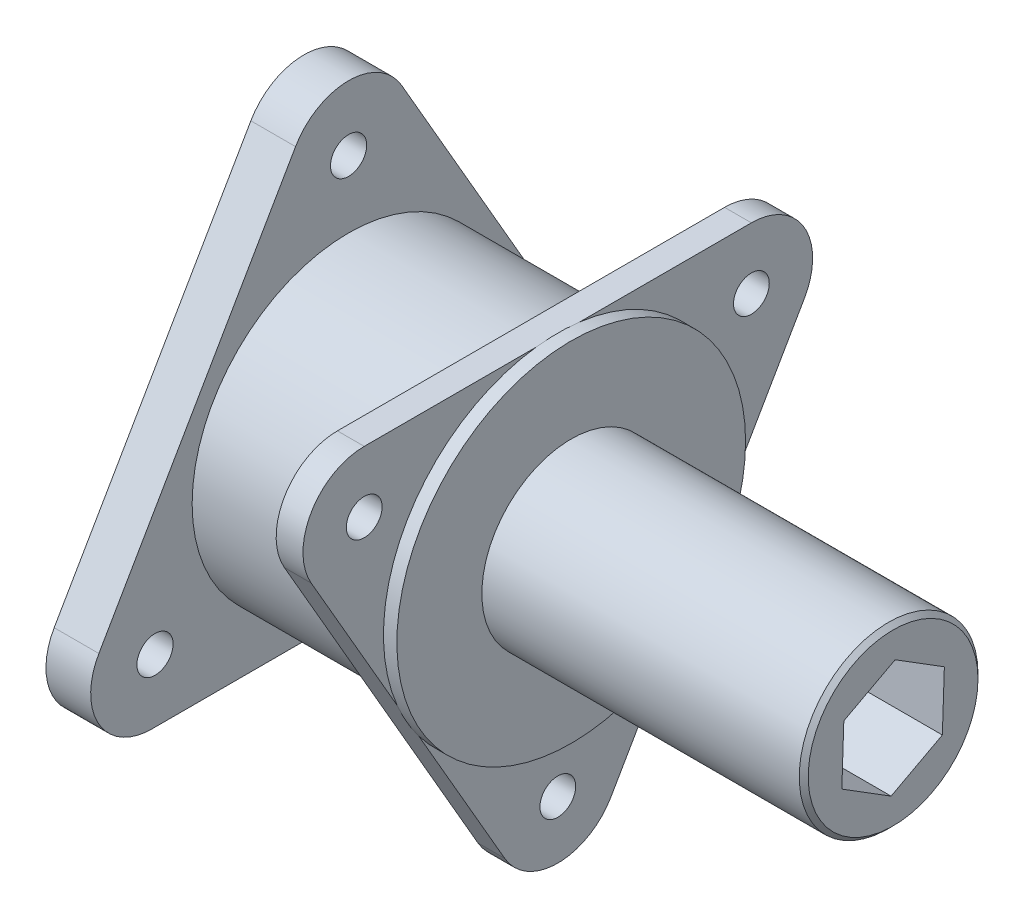
ISO-10303-21;
HEADER;
FILE_DESCRIPTION(('STEP AP214'),'2;1');
FILE_NAME('part.step','',(''),(''),'','','');
FILE_SCHEMA(('AUTOMOTIVE_DESIGN { 1 0 10303 214 1 1 1 1 }'));
ENDSEC;
DATA;
#1=APPLICATION_CONTEXT('core data for automotive mechanical design processes');
#2=APPLICATION_PROTOCOL_DEFINITION('international standard','automotive_design',2000,#1);
#3=PRODUCT_CONTEXT('',#1,'mechanical');
#4=PRODUCT('Part','Part','',(#3));
#5=PRODUCT_RELATED_PRODUCT_CATEGORY('part','',(#4));
#6=PRODUCT_DEFINITION_FORMATION('','',#4);
#7=PRODUCT_DEFINITION_CONTEXT('part definition',#1,'design');
#8=PRODUCT_DEFINITION('design','',#6,#7);
#9=PRODUCT_DEFINITION_SHAPE('','',#8);
#10=(LENGTH_UNIT() NAMED_UNIT(*) SI_UNIT(.MILLI.,.METRE.));
#11=(NAMED_UNIT(*) PLANE_ANGLE_UNIT() SI_UNIT($,.RADIAN.));
#12=(NAMED_UNIT(*) SI_UNIT($,.STERADIAN.) SOLID_ANGLE_UNIT());
#13=UNCERTAINTY_MEASURE_WITH_UNIT(LENGTH_MEASURE(1.E-05),#10,'distance_accuracy_value','');
#14=(GEOMETRIC_REPRESENTATION_CONTEXT(3) GLOBAL_UNCERTAINTY_ASSIGNED_CONTEXT((#13)) GLOBAL_UNIT_ASSIGNED_CONTEXT((#10,
#11,#12)) REPRESENTATION_CONTEXT('',''));
#15=CARTESIAN_POINT('',(0.,0.,0.));
#16=DIRECTION('',(0.,0.,1.));
#17=DIRECTION('',(1.,0.,0.));
#18=AXIS2_PLACEMENT_3D('',#15,#16,#17);
#19=CARTESIAN_POINT('',(56.8,25.,43.3012701892219));
#20=DIRECTION('',(1.,0.,0.));
#21=DIRECTION('',(0.,0.,-1.));
#22=AXIS2_PLACEMENT_3D('',#19,#20,#21);
#23=PLANE('',#22);
#24=CARTESIAN_POINT('',(56.8,-50.8,-4.31280489997456E-12));
#25=DIRECTION('',(1.,0.,0.));
#26=DIRECTION('',(0.,0.,-1.));
#27=AXIS2_PLACEMENT_3D('',#24,#25,#26);
#28=CIRCLE('',#27,4.00000000000446);
#29=CARTESIAN_POINT('',(56.8,-50.8,-4.00000000000878));
#30=VERTEX_POINT('',#29);
#31=EDGE_CURVE('E274',#30,#30,#28,.T.);
#32=ORIENTED_EDGE('',*,*,#31,.F.);
#33=EDGE_LOOP('',(#32));
#34=FACE_BOUND('',#33,.T.);
#35=DIRECTION('',(0.,0.866025403784439,-0.5));
#36=VECTOR('',#35,1.);
#37=CARTESIAN_POINT('',(56.8,18.15,-55.1658182210688));
#38=LINE('',#37,#36);
#39=CARTESIAN_POINT('',(56.8,-56.85,-11.8645480318468));
#40=VERTEX_POINT('',#39);
#41=CARTESIAN_POINT('',(56.8,-23.5312079594299,-31.1011615855431));
#42=VERTEX_POINT('',#41);
#43=EDGE_CURVE('E304',#40,#42,#38,.T.);
#44=ORIENTED_EDGE('',*,*,#43,.T.);
#45=CARTESIAN_POINT('',(56.8,0.,0.));
#46=DIRECTION('',(1.,0.,0.));
#47=DIRECTION('',(0.,0.,-1.));
#48=AXIS2_PLACEMENT_3D('',#45,#46,#47);
#49=CIRCLE('',#48,39.);
#50=CARTESIAN_POINT('',(56.8,-23.53120795943,31.1011615855431));
#51=VERTEX_POINT('',#50);
#52=EDGE_CURVE('E608',#51,#42,#49,.T.);
#53=ORIENTED_EDGE('',*,*,#52,.F.);
#54=DIRECTION('',(0.,-0.866025403784438,-0.5));
#55=VECTOR('',#54,1.);
#56=CARTESIAN_POINT('',(56.8,18.15,55.1658182210688));
#57=LINE('',#56,#55);
#58=CARTESIAN_POINT('',(56.8,-56.85,11.8645480318468));
#59=VERTEX_POINT('',#58);
#60=EDGE_CURVE('E294',#51,#59,#57,.T.);
#61=ORIENTED_EDGE('',*,*,#60,.T.);
#62=CARTESIAN_POINT('',(56.8,-50.,0.));
#63=DIRECTION('',(1.,0.,0.));
#64=DIRECTION('',(0.,0.,-1.));
#65=AXIS2_PLACEMENT_3D('',#62,#63,#64);
#66=CIRCLE('',#65,13.7);
#67=EDGE_CURVE('E300',#59,#40,#66,.T.);
#68=ORIENTED_EDGE('',*,*,#67,.T.);
#69=EDGE_LOOP('',(#44,#53,#61,#68));
#70=FACE_BOUND('',#69,.T.);
#71=ADVANCED_FACE('F42',(#34,#70),#23,.T.);
#72=CARTESIAN_POINT('',(56.8,25.,43.3012701892219));
#73=DIRECTION('',(1.,0.,0.));
#74=DIRECTION('',(0.,0.,-1.));
#75=AXIS2_PLACEMENT_3D('',#72,#73,#74);
#76=CIRCLE('',#75,4.00000000000057);
#77=CARTESIAN_POINT('',(56.8,25.,39.3012701892214));
#78=VERTEX_POINT('',#77);
#79=EDGE_CURVE('E265',#78,#78,#76,.T.);
#80=ORIENTED_EDGE('',*,*,#79,.F.);
#81=EDGE_LOOP('',(#80));
#82=FACE_BOUND('',#81,.T.);
#83=CARTESIAN_POINT('',(56.8,18.15,55.1658182210688));
#84=VERTEX_POINT('',#83);
#85=CARTESIAN_POINT('',(56.8,-15.1687920405701,35.9292046673724));
#86=VERTEX_POINT('',#85);
#87=EDGE_CURVE('E296',#84,#86,#57,.T.);
#88=ORIENTED_EDGE('',*,*,#87,.T.);
#89=CARTESIAN_POINT('',(56.8,38.7,4.82804308182919));
#90=VERTEX_POINT('',#89);
#91=EDGE_CURVE('E252',#90,#86,#49,.T.);
#92=ORIENTED_EDGE('',*,*,#91,.F.);
#93=DIRECTION('',(0.,0.,1.));
#94=VECTOR('',#93,1.);
#95=CARTESIAN_POINT('',(56.8,38.7,43.3012701892219));
#96=LINE('',#95,#94);
#97=CARTESIAN_POINT('',(56.8,38.7,43.3012701892219));
#98=VERTEX_POINT('',#97);
#99=EDGE_CURVE('E311',#90,#98,#96,.T.);
#100=ORIENTED_EDGE('',*,*,#99,.T.);
#101=CARTESIAN_POINT('',(56.8,25.,43.3012701892219));
#102=DIRECTION('',(1.,0.,0.));
#103=DIRECTION('',(0.,0.,-1.));
#104=AXIS2_PLACEMENT_3D('',#101,#102,#103);
#105=CIRCLE('',#104,13.7);
#106=EDGE_CURVE('E290',#98,#84,#105,.T.);
#107=ORIENTED_EDGE('',*,*,#106,.T.);
#108=EDGE_LOOP('',(#88,#92,#100,#107));
#109=FACE_BOUND('',#108,.T.);
#110=ADVANCED_FACE('F472',(#82,#109),#23,.T.);
#111=CARTESIAN_POINT('',(10.,-25.3999999999981,43.9940905122478));
#112=DIRECTION('',(1.,0.,0.));
#113=DIRECTION('',(0.,0.,-1.));
#114=AXIS2_PLACEMENT_3D('',#111,#112,#113);
#115=PLANE('',#114);
#116=CARTESIAN_POINT('',(10.,0.,0.));
#117=DIRECTION('',(1.,0.,0.));
#118=DIRECTION('',(0.,0.,-1.));
#119=AXIS2_PLACEMENT_3D('',#116,#117,#118);
#120=CIRCLE('',#119,35.);
#121=CARTESIAN_POINT('',(10.,0.,-35.));
#122=VERTEX_POINT('',#121);
#123=EDGE_CURVE('E357',#122,#122,#120,.T.);
#124=ORIENTED_EDGE('',*,*,#123,.F.);
#125=EDGE_LOOP('',(#124));
#126=FACE_BOUND('',#125,.T.);
#127=CARTESIAN_POINT('',(10.,-24.9999999999982,-43.3012701892251));
#128=DIRECTION('',(1.,0.,0.));
#129=DIRECTION('',(0.,0.,-1.));
#130=AXIS2_PLACEMENT_3D('',#127,#128,#129);
#131=CIRCLE('',#130,4.05000000000274);
#132=CARTESIAN_POINT('',(10.,-24.9999999999982,-47.3512701892279));
#133=VERTEX_POINT('',#132);
#134=EDGE_CURVE('E374',#133,#133,#131,.T.);
#135=ORIENTED_EDGE('',*,*,#134,.F.);
#136=EDGE_LOOP('',(#135));
#137=FACE_BOUND('',#136,.T.);
#138=CARTESIAN_POINT('',(10.,-25.3999999999981,43.9940905122478));
#139=DIRECTION('',(1.,0.,0.));
#140=DIRECTION('',(0.,0.,-1.));
#141=AXIS2_PLACEMENT_3D('',#138,#139,#140);
#142=CIRCLE('',#141,13.6999999999999);
#143=CARTESIAN_POINT('',(10.,-18.5499999999976,55.8586385440946));
#144=VERTEX_POINT('',#143);
#145=CARTESIAN_POINT('',(10.,-39.0999999999976,43.9940905122478));
#146=VERTEX_POINT('',#145);
#147=EDGE_CURVE('E390',#144,#146,#142,.T.);
#148=ORIENTED_EDGE('',*,*,#147,.T.);
#149=DIRECTION('',(0.,0.,-1.));
#150=VECTOR('',#149,1.);
#151=CARTESIAN_POINT('',(10.,-39.0999999999976,43.9940905122478));
#152=LINE('',#151,#150);
#153=CARTESIAN_POINT('',(10.,-39.0999999999976,-43.9940905122487));
#154=VERTEX_POINT('',#153);
#155=EDGE_CURVE('E394',#146,#154,#152,.T.);
#156=ORIENTED_EDGE('',*,*,#155,.T.);
#157=CARTESIAN_POINT('',(10.,-25.3999999999976,-43.9940905122487));
#158=DIRECTION('',(1.,0.,0.));
#159=DIRECTION('',(0.,0.,-1.));
#160=AXIS2_PLACEMENT_3D('',#157,#158,#159);
#161=CIRCLE('',#160,13.7);
#162=CARTESIAN_POINT('',(10.,-18.5499999999975,-55.8586385440954));
#163=VERTEX_POINT('',#162);
#164=EDGE_CURVE('E398',#154,#163,#161,.T.);
#165=ORIENTED_EDGE('',*,*,#164,.T.);
#166=DIRECTION('',(0.,0.866025403784436,0.500000000000005));
#167=VECTOR('',#166,1.);
#168=CARTESIAN_POINT('',(10.,57.6500000000001,-11.8645480318468));
#169=LINE('',#168,#167);
#170=CARTESIAN_POINT('',(10.,57.6500000000001,-11.8645480318468));
#171=VERTEX_POINT('',#170);
#172=EDGE_CURVE('E401',#163,#171,#169,.T.);
#173=ORIENTED_EDGE('',*,*,#172,.T.);
#174=CARTESIAN_POINT('',(10.,50.8,0.));
#175=DIRECTION('',(1.,0.,0.));
#176=DIRECTION('',(0.,0.,-1.));
#177=AXIS2_PLACEMENT_3D('',#174,#175,#176);
#178=CIRCLE('',#177,13.7);
#179=CARTESIAN_POINT('',(10.,57.65,11.8645480318468));
#180=VERTEX_POINT('',#179);
#181=EDGE_CURVE('E404',#171,#180,#178,.T.);
#182=ORIENTED_EDGE('',*,*,#181,.T.);
#183=DIRECTION('',(0.,-0.86602540378444,0.499999999999998));
#184=VECTOR('',#183,1.);
#185=CARTESIAN_POINT('',(10.,-18.5499999999976,55.8586385440946));
#186=LINE('',#185,#184);
#187=EDGE_CURVE('E407',#180,#144,#186,.T.);
#188=ORIENTED_EDGE('',*,*,#187,.T.);
#189=EDGE_LOOP('',(#148,#156,#165,#173,#182,#188));
#190=FACE_BOUND('',#189,.T.);
#191=CARTESIAN_POINT('',(10.,50.,0.));
#192=DIRECTION('',(1.,0.,0.));
#193=DIRECTION('',(0.,0.,-1.));
#194=AXIS2_PLACEMENT_3D('',#191,#192,#193);
#195=CIRCLE('',#194,4.05);
#196=CARTESIAN_POINT('',(10.,50.,-4.05));
#197=VERTEX_POINT('',#196);
#198=EDGE_CURVE('E382',#197,#197,#195,.T.);
#199=ORIENTED_EDGE('',*,*,#198,.F.);
#200=EDGE_LOOP('',(#199));
#201=FACE_BOUND('',#200,.T.);
#202=CARTESIAN_POINT('',(10.,-25.0000000000019,43.3012701892187));
#203=DIRECTION('',(1.,0.,0.));
#204=DIRECTION('',(0.,0.,-1.));
#205=AXIS2_PLACEMENT_3D('',#202,#203,#204);
#206=CIRCLE('',#205,4.05000000000405);
#207=CARTESIAN_POINT('',(10.,-25.0000000000019,39.2512701892147));
#208=VERTEX_POINT('',#207);
#209=EDGE_CURVE('E366',#208,#208,#206,.T.);
#210=ORIENTED_EDGE('',*,*,#209,.F.);
#211=EDGE_LOOP('',(#210));
#212=FACE_BOUND('',#211,.T.);
#213=ADVANCED_FACE('F479',(#126,#137,#190,#201,#212),#115,.T.);
#214=CARTESIAN_POINT('',(0.,-25.3999999999981,43.9940905122478));
#215=DIRECTION('',(1.,0.,0.));
#216=DIRECTION('',(0.,0.,-1.));
#217=AXIS2_PLACEMENT_3D('',#214,#215,#216);
#218=PLANE('',#217);
#219=DIRECTION('',(0.,0.4699965831254,-0.882668234304628));
#220=VECTOR('',#219,1.);
#221=CARTESIAN_POINT('',(0.,12.9827349910157,-0.445636794999472));
#222=LINE('',#221,#220);
#223=CARTESIAN_POINT('',(0.,6.87730028083846,11.020559915321));
#224=VERTEX_POINT('',#223);
#225=CARTESIAN_POINT('',(0.,12.9827349910157,-0.445636794999472));
#226=VERTEX_POINT('',#225);
#227=EDGE_CURVE('E561',#224,#226,#222,.T.);
#228=ORIENTED_EDGE('',*,*,#227,.F.);
#229=DIRECTION('',(0.,0.999411405584063,-0.0343051364738331));
#230=VECTOR('',#229,1.);
#231=CARTESIAN_POINT('',(0.,6.87730028083846,11.020559915321));
#232=LINE('',#231,#230);
#233=CARTESIAN_POINT('',(0.,-6.10543471017721,11.4661967103204));
#234=VERTEX_POINT('',#233);
#235=EDGE_CURVE('E242',#234,#224,#232,.T.);
#236=ORIENTED_EDGE('',*,*,#235,.F.);
#237=DIRECTION('',(0.,0.529414822458663,0.848363097830795));
#238=VECTOR('',#237,1.);
#239=CARTESIAN_POINT('',(0.,-6.10543471017721,11.4661967103204));
#240=LINE('',#239,#238);
#241=CARTESIAN_POINT('',(0.,-12.9827349910157,0.445636794999475));
#242=VERTEX_POINT('',#241);
#243=EDGE_CURVE('E238',#242,#234,#240,.T.);
#244=ORIENTED_EDGE('',*,*,#243,.F.);
#245=DIRECTION('',(0.,-0.4699965831254,0.882668234304628));
#246=VECTOR('',#245,1.);
#247=CARTESIAN_POINT('',(0.,-12.9827349910157,0.445636794999474));
#248=LINE('',#247,#246);
#249=CARTESIAN_POINT('',(0.,-6.87730028083846,-11.020559915321));
#250=VERTEX_POINT('',#249);
#251=EDGE_CURVE('E193',#250,#242,#248,.T.);
#252=ORIENTED_EDGE('',*,*,#251,.F.);
#253=DIRECTION('',(0.,-0.999411405584063,0.0343051364738327));
#254=VECTOR('',#253,1.);
#255=CARTESIAN_POINT('',(0.,-6.87730028083846,-11.020559915321));
#256=LINE('',#255,#254);
#257=CARTESIAN_POINT('',(0.,6.10543471017722,-11.4661967103204));
#258=VERTEX_POINT('',#257);
#259=EDGE_CURVE('E574',#258,#250,#256,.T.);
#260=ORIENTED_EDGE('',*,*,#259,.F.);
#261=DIRECTION('',(0.,-0.529414822458663,-0.848363097830795));
#262=VECTOR('',#261,1.);
#263=CARTESIAN_POINT('',(0.,6.10543471017722,-11.4661967103204));
#264=LINE('',#263,#262);
#265=EDGE_CURVE('E567',#226,#258,#264,.T.);
#266=ORIENTED_EDGE('',*,*,#265,.F.);
#267=EDGE_LOOP('',(#228,#236,#244,#252,#260,#266));
#268=FACE_BOUND('',#267,.T.);
#269=CARTESIAN_POINT('',(0.,-25.3999999999981,43.9940905122478));
#270=DIRECTION('',(1.,0.,0.));
#271=DIRECTION('',(0.,0.,-1.));
#272=AXIS2_PLACEMENT_3D('',#269,#270,#271);
#273=CIRCLE('',#272,13.6999999999999);
#274=CARTESIAN_POINT('',(0.,-18.5499999999976,55.8586385440946));
#275=VERTEX_POINT('',#274);
#276=CARTESIAN_POINT('',(0.,-39.0999999999976,43.9940905122478));
#277=VERTEX_POINT('',#276);
#278=EDGE_CURVE('E386',#275,#277,#273,.T.);
#279=ORIENTED_EDGE('',*,*,#278,.F.);
#280=DIRECTION('',(0.,-0.86602540378444,0.499999999999998));
#281=VECTOR('',#280,1.);
#282=CARTESIAN_POINT('',(0.,-18.5499999999976,55.8586385440946));
#283=LINE('',#282,#281);
#284=CARTESIAN_POINT('',(0.,57.65,11.8645480318468));
#285=VERTEX_POINT('',#284);
#286=EDGE_CURVE('E395',#285,#275,#283,.T.);
#287=ORIENTED_EDGE('',*,*,#286,.F.);
#288=CARTESIAN_POINT('',(0.,50.8,0.));
#289=DIRECTION('',(1.,0.,0.));
#290=DIRECTION('',(0.,0.,-1.));
#291=AXIS2_PLACEMENT_3D('',#288,#289,#290);
#292=CIRCLE('',#291,13.7);
#293=CARTESIAN_POINT('',(0.,57.6500000000001,-11.8645480318468));
#294=VERTEX_POINT('',#293);
#295=EDGE_CURVE('E423',#294,#285,#292,.T.);
#296=ORIENTED_EDGE('',*,*,#295,.F.);
#297=DIRECTION('',(0.,0.866025403784436,0.500000000000005));
#298=VECTOR('',#297,1.);
#299=CARTESIAN_POINT('',(0.,57.6500000000001,-11.8645480318468));
#300=LINE('',#299,#298);
#301=CARTESIAN_POINT('',(0.,-18.5499999999975,-55.8586385440954));
#302=VERTEX_POINT('',#301);
#303=EDGE_CURVE('E420',#302,#294,#300,.T.);
#304=ORIENTED_EDGE('',*,*,#303,.F.);
#305=CARTESIAN_POINT('',(0.,-25.3999999999976,-43.9940905122487));
#306=DIRECTION('',(1.,0.,0.));
#307=DIRECTION('',(0.,0.,-1.));
#308=AXIS2_PLACEMENT_3D('',#305,#306,#307);
#309=CIRCLE('',#308,13.7);
#310=CARTESIAN_POINT('',(0.,-39.0999999999976,-43.9940905122487));
#311=VERTEX_POINT('',#310);
#312=EDGE_CURVE('E417',#311,#302,#309,.T.);
#313=ORIENTED_EDGE('',*,*,#312,.F.);
#314=DIRECTION('',(0.,0.,-1.));
#315=VECTOR('',#314,1.);
#316=CARTESIAN_POINT('',(0.,-39.0999999999976,43.9940905122478));
#317=LINE('',#316,#315);
#318=EDGE_CURVE('E414',#277,#311,#317,.T.);
#319=ORIENTED_EDGE('',*,*,#318,.F.);
#320=EDGE_LOOP('',(#279,#287,#296,#304,#313,#319));
#321=FACE_BOUND('',#320,.T.);
#322=CARTESIAN_POINT('',(0.,50.,0.));
#323=DIRECTION('',(1.,0.,0.));
#324=DIRECTION('',(0.,0.,-1.));
#325=AXIS2_PLACEMENT_3D('',#322,#323,#324);
#326=CIRCLE('',#325,4.05);
#327=CARTESIAN_POINT('',(0.,50.,-4.05));
#328=VERTEX_POINT('',#327);
#329=EDGE_CURVE('E378',#328,#328,#326,.T.);
#330=ORIENTED_EDGE('',*,*,#329,.T.);
#331=EDGE_LOOP('',(#330));
#332=FACE_BOUND('',#331,.T.);
#333=CARTESIAN_POINT('',(0.,-24.9999999999982,-43.3012701892251));
#334=DIRECTION('',(1.,0.,0.));
#335=DIRECTION('',(0.,0.,-1.));
#336=AXIS2_PLACEMENT_3D('',#333,#334,#335);
#337=CIRCLE('',#336,4.05000000000274);
#338=CARTESIAN_POINT('',(0.,-24.9999999999982,-47.3512701892279));
#339=VERTEX_POINT('',#338);
#340=EDGE_CURVE('E370',#339,#339,#337,.T.);
#341=ORIENTED_EDGE('',*,*,#340,.T.);
#342=EDGE_LOOP('',(#341));
#343=FACE_BOUND('',#342,.T.);
#344=CARTESIAN_POINT('',(0.,-25.0000000000019,43.3012701892187));
#345=DIRECTION('',(1.,0.,0.));
#346=DIRECTION('',(0.,0.,-1.));
#347=AXIS2_PLACEMENT_3D('',#344,#345,#346);
#348=CIRCLE('',#347,4.05000000000405);
#349=CARTESIAN_POINT('',(0.,-25.0000000000019,39.2512701892147));
#350=VERTEX_POINT('',#349);
#351=EDGE_CURVE('E362',#350,#350,#348,.T.);
#352=ORIENTED_EDGE('',*,*,#351,.T.);
#353=EDGE_LOOP('',(#352));
#354=FACE_BOUND('',#353,.T.);
#355=ADVANCED_FACE('F572',(#268,#321,#332,#343,#354),#218,.F.);
#356=CARTESIAN_POINT('',(10.,-25.3999999999981,43.9940905122478));
#357=DIRECTION('',(-1.,0.,0.));
#358=DIRECTION('',(0.,0.,1.));
#359=AXIS2_PLACEMENT_3D('',#356,#357,#358);
#360=CYLINDRICAL_SURFACE('',#359,13.6999999999999);
#361=ORIENTED_EDGE('',*,*,#278,.T.);
#362=DIRECTION('',(-1.,0.,0.));
#363=VECTOR('',#362,1.);
#364=CARTESIAN_POINT('',(10.,-39.0999999999976,43.9940905122478));
#365=LINE('',#364,#363);
#366=EDGE_CURVE('E447',#146,#277,#365,.T.);
#367=ORIENTED_EDGE('',*,*,#366,.F.);
#368=ORIENTED_EDGE('',*,*,#147,.F.);
#369=DIRECTION('',(-1.,0.,0.));
#370=VECTOR('',#369,1.);
#371=CARTESIAN_POINT('',(10.,-18.5499999999976,55.8586385440946));
#372=LINE('',#371,#370);
#373=EDGE_CURVE('E410',#144,#275,#372,.T.);
#374=ORIENTED_EDGE('',*,*,#373,.T.);
#375=EDGE_LOOP('',(#361,#367,#368,#374));
#376=FACE_BOUND('',#375,.T.);
#377=ADVANCED_FACE('F994',(#376),#360,.T.);
#378=CARTESIAN_POINT('',(10.,-39.0999999999976,43.9940905122478));
#379=DIRECTION('',(0.,1.,0.));
#380=DIRECTION('',(0.,0.,1.));
#381=AXIS2_PLACEMENT_3D('',#378,#379,#380);
#382=PLANE('',#381);
#383=ORIENTED_EDGE('',*,*,#318,.T.);
#384=DIRECTION('',(-1.,0.,0.));
#385=VECTOR('',#384,1.);
#386=CARTESIAN_POINT('',(10.,-39.0999999999976,-43.9940905122487));
#387=LINE('',#386,#385);
#388=EDGE_CURVE('E443',#154,#311,#387,.T.);
#389=ORIENTED_EDGE('',*,*,#388,.F.);
#390=ORIENTED_EDGE('',*,*,#155,.F.);
#391=ORIENTED_EDGE('',*,*,#366,.T.);
#392=EDGE_LOOP('',(#383,#389,#390,#391));
#393=FACE_BOUND('',#392,.T.);
#394=ADVANCED_FACE('F984',(#393),#382,.F.);
#395=CARTESIAN_POINT('',(10.,-25.3999999999976,-43.9940905122487));
#396=DIRECTION('',(-1.,0.,0.));
#397=DIRECTION('',(0.,0.,1.));
#398=AXIS2_PLACEMENT_3D('',#395,#396,#397);
#399=CYLINDRICAL_SURFACE('',#398,13.7);
#400=ORIENTED_EDGE('',*,*,#312,.T.);
#401=DIRECTION('',(-1.,0.,0.));
#402=VECTOR('',#401,1.);
#403=CARTESIAN_POINT('',(10.,-18.5499999999975,-55.8586385440954));
#404=LINE('',#403,#402);
#405=EDGE_CURVE('E439',#163,#302,#404,.T.);
#406=ORIENTED_EDGE('',*,*,#405,.F.);
#407=ORIENTED_EDGE('',*,*,#164,.F.);
#408=ORIENTED_EDGE('',*,*,#388,.T.);
#409=EDGE_LOOP('',(#400,#406,#407,#408));
#410=FACE_BOUND('',#409,.T.);
#411=ADVANCED_FACE('F974',(#410),#399,.T.);
#412=CARTESIAN_POINT('',(10.,57.6500000000001,-11.8645480318468));
#413=DIRECTION('',(0.,-0.500000000000005,0.866025403784436));
#414=DIRECTION('',(0.,-0.866025403784436,-0.500000000000005));
#415=AXIS2_PLACEMENT_3D('',#412,#413,#414);
#416=PLANE('',#415);
#417=ORIENTED_EDGE('',*,*,#303,.T.);
#418=DIRECTION('',(-1.,0.,0.));
#419=VECTOR('',#418,1.);
#420=CARTESIAN_POINT('',(10.,57.6500000000001,-11.8645480318468));
#421=LINE('',#420,#419);
#422=EDGE_CURVE('E435',#171,#294,#421,.T.);
#423=ORIENTED_EDGE('',*,*,#422,.F.);
#424=ORIENTED_EDGE('',*,*,#172,.F.);
#425=ORIENTED_EDGE('',*,*,#405,.T.);
#426=EDGE_LOOP('',(#417,#423,#424,#425));
#427=FACE_BOUND('',#426,.T.);
#428=ADVANCED_FACE('F964',(#427),#416,.F.);
#429=CARTESIAN_POINT('',(10.,50.8,0.));
#430=DIRECTION('',(-1.,0.,0.));
#431=DIRECTION('',(0.,0.,1.));
#432=AXIS2_PLACEMENT_3D('',#429,#430,#431);
#433=CYLINDRICAL_SURFACE('',#432,13.7);
#434=ORIENTED_EDGE('',*,*,#295,.T.);
#435=DIRECTION('',(-1.,0.,0.));
#436=VECTOR('',#435,1.);
#437=CARTESIAN_POINT('',(10.,57.65,11.8645480318468));
#438=LINE('',#437,#436);
#439=EDGE_CURVE('E431',#180,#285,#438,.T.);
#440=ORIENTED_EDGE('',*,*,#439,.F.);
#441=ORIENTED_EDGE('',*,*,#181,.F.);
#442=ORIENTED_EDGE('',*,*,#422,.T.);
#443=EDGE_LOOP('',(#434,#440,#441,#442));
#444=FACE_BOUND('',#443,.T.);
#445=ADVANCED_FACE('F954',(#444),#433,.T.);
#446=CARTESIAN_POINT('',(10.,-18.5499999999976,55.8586385440946));
#447=DIRECTION('',(0.,-0.499999999999998,-0.86602540378444));
#448=DIRECTION('',(0.,0.86602540378444,-0.499999999999998));
#449=AXIS2_PLACEMENT_3D('',#446,#447,#448);
#450=PLANE('',#449);
#451=ORIENTED_EDGE('',*,*,#286,.T.);
#452=ORIENTED_EDGE('',*,*,#373,.F.);
#453=ORIENTED_EDGE('',*,*,#187,.F.);
#454=ORIENTED_EDGE('',*,*,#439,.T.);
#455=EDGE_LOOP('',(#451,#452,#453,#454));
#456=FACE_BOUND('',#455,.T.);
#457=ADVANCED_FACE('F944',(#456),#450,.F.);
#458=CARTESIAN_POINT('',(10.,50.,0.));
#459=DIRECTION('',(-1.,0.,0.));
#460=DIRECTION('',(0.,0.,1.));
#461=AXIS2_PLACEMENT_3D('',#458,#459,#460);
#462=CYLINDRICAL_SURFACE('',#461,4.05);
#463=ORIENTED_EDGE('',*,*,#198,.T.);
#464=EDGE_LOOP('',(#463));
#465=FACE_BOUND('',#464,.T.);
#466=ORIENTED_EDGE('',*,*,#329,.F.);
#467=EDGE_LOOP('',(#466));
#468=FACE_BOUND('',#467,.T.);
#469=ADVANCED_FACE('F934',(#465,#468),#462,.F.);
#470=CARTESIAN_POINT('',(10.,-24.9999999999982,-43.3012701892251));
#471=DIRECTION('',(-1.,0.,0.));
#472=DIRECTION('',(0.,0.,1.));
#473=AXIS2_PLACEMENT_3D('',#470,#471,#472);
#474=CYLINDRICAL_SURFACE('',#473,4.05000000000274);
#475=ORIENTED_EDGE('',*,*,#134,.T.);
#476=EDGE_LOOP('',(#475));
#477=FACE_BOUND('',#476,.T.);
#478=ORIENTED_EDGE('',*,*,#340,.F.);
#479=EDGE_LOOP('',(#478));
#480=FACE_BOUND('',#479,.T.);
#481=ADVANCED_FACE('F924',(#477,#480),#474,.F.);
#482=CARTESIAN_POINT('',(10.,-25.0000000000019,43.3012701892187));
#483=DIRECTION('',(-1.,0.,0.));
#484=DIRECTION('',(0.,0.,1.));
#485=AXIS2_PLACEMENT_3D('',#482,#483,#484);
#486=CYLINDRICAL_SURFACE('',#485,4.05000000000405);
#487=ORIENTED_EDGE('',*,*,#209,.T.);
#488=EDGE_LOOP('',(#487));
#489=FACE_BOUND('',#488,.T.);
#490=ORIENTED_EDGE('',*,*,#351,.F.);
#491=EDGE_LOOP('',(#490));
#492=FACE_BOUND('',#491,.T.);
#493=ADVANCED_FACE('F495',(#489,#492),#486,.F.);
#494=CARTESIAN_POINT('',(50.8,0.,0.));
#495=DIRECTION('',(-1.,0.,0.));
#496=DIRECTION('',(0.,0.,1.));
#497=AXIS2_PLACEMENT_3D('',#494,#495,#496);
#498=CYLINDRICAL_SURFACE('',#497,35.);
#499=CARTESIAN_POINT('',(50.8,0.,0.));
#500=DIRECTION('',(1.,0.,0.));
#501=DIRECTION('',(0.,0.,-1.));
#502=AXIS2_PLACEMENT_3D('',#499,#500,#501);
#503=CIRCLE('',#502,35.);
#504=CARTESIAN_POINT('',(50.8,0.,-35.));
#505=VERTEX_POINT('',#504);
#506=EDGE_CURVE('E358',#505,#505,#503,.T.);
#507=ORIENTED_EDGE('',*,*,#506,.F.);
#508=EDGE_LOOP('',(#507));
#509=FACE_BOUND('',#508,.T.);
#510=ORIENTED_EDGE('',*,*,#123,.T.);
#511=EDGE_LOOP('',(#510));
#512=FACE_BOUND('',#511,.T.);
#513=ADVANCED_FACE('F487',(#509,#512),#498,.T.);
#514=CARTESIAN_POINT('',(56.8,38.7,-43.3012701892219));
#515=VERTEX_POINT('',#514);
#516=CARTESIAN_POINT('',(56.8,38.7,-4.82804308182917));
#517=VERTEX_POINT('',#516);
#518=EDGE_CURVE('E312',#515,#517,#96,.T.);
#519=ORIENTED_EDGE('',*,*,#518,.T.);
#520=CARTESIAN_POINT('',(56.8,-15.1687920405701,-35.9292046673724));
#521=VERTEX_POINT('',#520);
#522=EDGE_CURVE('E241',#521,#517,#49,.T.);
#523=ORIENTED_EDGE('',*,*,#522,.F.);
#524=CARTESIAN_POINT('',(56.8,18.15,-55.1658182210688));
#525=VERTEX_POINT('',#524);
#526=EDGE_CURVE('E303',#521,#525,#38,.T.);
#527=ORIENTED_EDGE('',*,*,#526,.T.);
#528=CARTESIAN_POINT('',(56.8,25.,-43.3012701892219));
#529=DIRECTION('',(1.,0.,0.));
#530=DIRECTION('',(0.,0.,-1.));
#531=AXIS2_PLACEMENT_3D('',#528,#529,#530);
#532=CIRCLE('',#531,13.7);
#533=EDGE_CURVE('E308',#525,#515,#532,.T.);
#534=ORIENTED_EDGE('',*,*,#533,.T.);
#535=EDGE_LOOP('',(#519,#523,#527,#534));
#536=FACE_BOUND('',#535,.T.);
#537=CARTESIAN_POINT('',(56.8,25.,-43.3012701892219));
#538=DIRECTION('',(1.,0.,0.));
#539=DIRECTION('',(0.,0.,-1.));
#540=AXIS2_PLACEMENT_3D('',#537,#538,#539);
#541=CIRCLE('',#540,4.00000000000062);
#542=CARTESIAN_POINT('',(56.8,25.,-47.3012701892225));
#543=VERTEX_POINT('',#542);
#544=EDGE_CURVE('E282',#543,#543,#541,.T.);
#545=ORIENTED_EDGE('',*,*,#544,.F.);
#546=EDGE_LOOP('',(#545));
#547=FACE_BOUND('',#546,.T.);
#548=ADVANCED_FACE('F475',(#536,#547),#23,.T.);
#549=CARTESIAN_POINT('',(50.8,25.,43.3012701892219));
#550=DIRECTION('',(1.,0.,0.));
#551=DIRECTION('',(0.,0.,-1.));
#552=AXIS2_PLACEMENT_3D('',#549,#550,#551);
#553=PLANE('',#552);
#554=ORIENTED_EDGE('',*,*,#506,.T.);
#555=EDGE_LOOP('',(#554));
#556=FACE_BOUND('',#555,.T.);
#557=CARTESIAN_POINT('',(50.8,25.,43.3012701892219));
#558=DIRECTION('',(1.,0.,0.));
#559=DIRECTION('',(0.,0.,-1.));
#560=AXIS2_PLACEMENT_3D('',#557,#558,#559);
#561=CIRCLE('',#560,13.7);
#562=CARTESIAN_POINT('',(50.8,38.7,43.3012701892219));
#563=VERTEX_POINT('',#562);
#564=CARTESIAN_POINT('',(50.8,18.15,55.1658182210688));
#565=VERTEX_POINT('',#564);
#566=EDGE_CURVE('E286',#563,#565,#561,.T.);
#567=ORIENTED_EDGE('',*,*,#566,.F.);
#568=DIRECTION('',(0.,0.,1.));
#569=VECTOR('',#568,1.);
#570=CARTESIAN_POINT('',(50.8,38.7,43.3012701892219));
#571=LINE('',#570,#569);
#572=CARTESIAN_POINT('',(50.8,38.7,-43.3012701892219));
#573=VERTEX_POINT('',#572);
#574=EDGE_CURVE('E295',#573,#563,#571,.T.);
#575=ORIENTED_EDGE('',*,*,#574,.F.);
#576=CARTESIAN_POINT('',(50.8,25.,-43.3012701892219));
#577=DIRECTION('',(1.,0.,0.));
#578=DIRECTION('',(0.,0.,-1.));
#579=AXIS2_PLACEMENT_3D('',#576,#577,#578);
#580=CIRCLE('',#579,13.7);
#581=CARTESIAN_POINT('',(50.8,18.15,-55.1658182210688));
#582=VERTEX_POINT('',#581);
#583=EDGE_CURVE('E329',#582,#573,#580,.T.);
#584=ORIENTED_EDGE('',*,*,#583,.F.);
#585=DIRECTION('',(0.,0.866025403784439,-0.5));
#586=VECTOR('',#585,1.);
#587=CARTESIAN_POINT('',(50.8,18.15,-55.1658182210688));
#588=LINE('',#587,#586);
#589=CARTESIAN_POINT('',(50.8,-56.85,-11.8645480318468));
#590=VERTEX_POINT('',#589);
#591=EDGE_CURVE('E326',#590,#582,#588,.T.);
#592=ORIENTED_EDGE('',*,*,#591,.F.);
#593=CARTESIAN_POINT('',(50.8,-50.,0.));
#594=DIRECTION('',(1.,0.,0.));
#595=DIRECTION('',(0.,0.,-1.));
#596=AXIS2_PLACEMENT_3D('',#593,#594,#595);
#597=CIRCLE('',#596,13.7);
#598=CARTESIAN_POINT('',(50.8,-56.85,11.8645480318468));
#599=VERTEX_POINT('',#598);
#600=EDGE_CURVE('E323',#599,#590,#597,.T.);
#601=ORIENTED_EDGE('',*,*,#600,.F.);
#602=DIRECTION('',(0.,-0.866025403784438,-0.5));
#603=VECTOR('',#602,1.);
#604=CARTESIAN_POINT('',(50.8,18.15,55.1658182210688));
#605=LINE('',#604,#603);
#606=EDGE_CURVE('E320',#565,#599,#605,.T.);
#607=ORIENTED_EDGE('',*,*,#606,.F.);
#608=EDGE_LOOP('',(#567,#575,#584,#592,#601,#607));
#609=FACE_BOUND('',#608,.T.);
#610=CARTESIAN_POINT('',(50.8,25.,-43.3012701892219));
#611=DIRECTION('',(1.,0.,0.));
#612=DIRECTION('',(0.,0.,-1.));
#613=AXIS2_PLACEMENT_3D('',#610,#611,#612);
#614=CIRCLE('',#613,4.00000000000062);
#615=CARTESIAN_POINT('',(50.8,25.,-47.3012701892225));
#616=VERTEX_POINT('',#615);
#617=EDGE_CURVE('E278',#616,#616,#614,.T.);
#618=ORIENTED_EDGE('',*,*,#617,.T.);
#619=EDGE_LOOP('',(#618));
#620=FACE_BOUND('',#619,.T.);
#621=CARTESIAN_POINT('',(50.8,-50.8,-4.31280489997456E-12));
#622=DIRECTION('',(1.,0.,0.));
#623=DIRECTION('',(0.,0.,-1.));
#624=AXIS2_PLACEMENT_3D('',#621,#622,#623);
#625=CIRCLE('',#624,4.00000000000446);
#626=CARTESIAN_POINT('',(50.8,-50.8,-4.00000000000878));
#627=VERTEX_POINT('',#626);
#628=EDGE_CURVE('E269',#627,#627,#625,.T.);
#629=ORIENTED_EDGE('',*,*,#628,.T.);
#630=EDGE_LOOP('',(#629));
#631=FACE_BOUND('',#630,.T.);
#632=CARTESIAN_POINT('',(50.8,25.,43.3012701892219));
#633=DIRECTION('',(1.,0.,0.));
#634=DIRECTION('',(0.,0.,-1.));
#635=AXIS2_PLACEMENT_3D('',#632,#633,#634);
#636=CIRCLE('',#635,4.00000000000057);
#637=CARTESIAN_POINT('',(50.8,25.,39.3012701892214));
#638=VERTEX_POINT('',#637);
#639=EDGE_CURVE('E270',#638,#638,#636,.T.);
#640=ORIENTED_EDGE('',*,*,#639,.T.);
#641=EDGE_LOOP('',(#640));
#642=FACE_BOUND('',#641,.T.);
#643=ADVANCED_FACE('F486',(#556,#609,#620,#631,#642),#553,.F.);
#644=CARTESIAN_POINT('',(56.8,25.,43.3012701892219));
#645=DIRECTION('',(-1.,0.,0.));
#646=DIRECTION('',(0.,0.,1.));
#647=AXIS2_PLACEMENT_3D('',#644,#645,#646);
#648=CYLINDRICAL_SURFACE('',#647,13.7);
#649=ORIENTED_EDGE('',*,*,#566,.T.);
#650=DIRECTION('',(-1.,0.,0.));
#651=VECTOR('',#650,1.);
#652=CARTESIAN_POINT('',(56.8,18.15,55.1658182210688));
#653=LINE('',#652,#651);
#654=EDGE_CURVE('E353',#84,#565,#653,.T.);
#655=ORIENTED_EDGE('',*,*,#654,.F.);
#656=ORIENTED_EDGE('',*,*,#106,.F.);
#657=DIRECTION('',(-1.,0.,0.));
#658=VECTOR('',#657,1.);
#659=CARTESIAN_POINT('',(56.8,38.7,43.3012701892219));
#660=LINE('',#659,#658);
#661=EDGE_CURVE('E316',#98,#563,#660,.T.);
#662=ORIENTED_EDGE('',*,*,#661,.T.);
#663=EDGE_LOOP('',(#649,#655,#656,#662));
#664=FACE_BOUND('',#663,.T.);
#665=ADVANCED_FACE('F493',(#664),#648,.T.);
#666=CARTESIAN_POINT('',(56.8,18.15,55.1658182210688));
#667=DIRECTION('',(0.,0.5,-0.866025403784438));
#668=DIRECTION('',(0.,0.866025403784439,0.5));
#669=AXIS2_PLACEMENT_3D('',#666,#667,#668);
#670=PLANE('',#669);
#671=ORIENTED_EDGE('',*,*,#606,.T.);
#672=DIRECTION('',(-1.,0.,0.));
#673=VECTOR('',#672,1.);
#674=CARTESIAN_POINT('',(56.8,-56.85,11.8645480318468));
#675=LINE('',#674,#673);
#676=EDGE_CURVE('E349',#59,#599,#675,.T.);
#677=ORIENTED_EDGE('',*,*,#676,.F.);
#678=ORIENTED_EDGE('',*,*,#60,.F.);
#679=DIRECTION('',(0.,-0.866025403784439,-0.5));
#680=VECTOR('',#679,1.);
#681=CARTESIAN_POINT('',(56.8,18.15,55.1658182210688));
#682=LINE('',#681,#680);
#683=EDGE_CURVE('E260',#86,#51,#682,.T.);
#684=ORIENTED_EDGE('',*,*,#683,.F.);
#685=ORIENTED_EDGE('',*,*,#87,.F.);
#686=ORIENTED_EDGE('',*,*,#654,.T.);
#687=EDGE_LOOP('',(#671,#677,#678,#684,#685,#686));
#688=FACE_BOUND('',#687,.T.);
#689=ADVANCED_FACE('F690',(#688),#670,.F.);
#690=CARTESIAN_POINT('',(56.8,-50.,0.));
#691=DIRECTION('',(-1.,0.,0.));
#692=DIRECTION('',(0.,0.,1.));
#693=AXIS2_PLACEMENT_3D('',#690,#691,#692);
#694=CYLINDRICAL_SURFACE('',#693,13.7);
#695=ORIENTED_EDGE('',*,*,#600,.T.);
#696=DIRECTION('',(-1.,0.,0.));
#697=VECTOR('',#696,1.);
#698=CARTESIAN_POINT('',(56.8,-56.85,-11.8645480318468));
#699=LINE('',#698,#697);
#700=EDGE_CURVE('E345',#40,#590,#699,.T.);
#701=ORIENTED_EDGE('',*,*,#700,.F.);
#702=ORIENTED_EDGE('',*,*,#67,.F.);
#703=ORIENTED_EDGE('',*,*,#676,.T.);
#704=EDGE_LOOP('',(#695,#701,#702,#703));
#705=FACE_BOUND('',#704,.T.);
#706=ADVANCED_FACE('F705',(#705),#694,.T.);
#707=CARTESIAN_POINT('',(56.8,18.15,-55.1658182210688));
#708=DIRECTION('',(0.,0.5,0.866025403784439));
#709=DIRECTION('',(0.,-0.866025403784439,0.5));
#710=AXIS2_PLACEMENT_3D('',#707,#708,#709);
#711=PLANE('',#710);
#712=ORIENTED_EDGE('',*,*,#591,.T.);
#713=DIRECTION('',(-1.,0.,0.));
#714=VECTOR('',#713,1.);
#715=CARTESIAN_POINT('',(56.8,18.15,-55.1658182210688));
#716=LINE('',#715,#714);
#717=EDGE_CURVE('E341',#525,#582,#716,.T.);
#718=ORIENTED_EDGE('',*,*,#717,.F.);
#719=ORIENTED_EDGE('',*,*,#526,.F.);
#720=DIRECTION('',(0.,0.866025403784439,-0.5));
#721=VECTOR('',#720,1.);
#722=CARTESIAN_POINT('',(56.8,18.15,-55.1658182210688));
#723=LINE('',#722,#721);
#724=EDGE_CURVE('E256',#42,#521,#723,.T.);
#725=ORIENTED_EDGE('',*,*,#724,.F.);
#726=ORIENTED_EDGE('',*,*,#43,.F.);
#727=ORIENTED_EDGE('',*,*,#700,.T.);
#728=EDGE_LOOP('',(#712,#718,#719,#725,#726,#727));
#729=FACE_BOUND('',#728,.T.);
#730=ADVANCED_FACE('F709',(#729),#711,.F.);
#731=CARTESIAN_POINT('',(56.8,25.,-43.3012701892219));
#732=DIRECTION('',(-1.,0.,0.));
#733=DIRECTION('',(0.,0.,1.));
#734=AXIS2_PLACEMENT_3D('',#731,#732,#733);
#735=CYLINDRICAL_SURFACE('',#734,13.7);
#736=ORIENTED_EDGE('',*,*,#583,.T.);
#737=DIRECTION('',(-1.,0.,0.));
#738=VECTOR('',#737,1.);
#739=CARTESIAN_POINT('',(56.8,38.7,-43.3012701892219));
#740=LINE('',#739,#738);
#741=EDGE_CURVE('E337',#515,#573,#740,.T.);
#742=ORIENTED_EDGE('',*,*,#741,.F.);
#743=ORIENTED_EDGE('',*,*,#533,.F.);
#744=ORIENTED_EDGE('',*,*,#717,.T.);
#745=EDGE_LOOP('',(#736,#742,#743,#744));
#746=FACE_BOUND('',#745,.T.);
#747=ADVANCED_FACE('F859',(#746),#735,.T.);
#748=CARTESIAN_POINT('',(56.8,38.7,43.3012701892219));
#749=DIRECTION('',(0.,-1.,0.));
#750=DIRECTION('',(0.,0.,-1.));
#751=AXIS2_PLACEMENT_3D('',#748,#749,#750);
#752=PLANE('',#751);
#753=ORIENTED_EDGE('',*,*,#574,.T.);
#754=ORIENTED_EDGE('',*,*,#661,.F.);
#755=ORIENTED_EDGE('',*,*,#99,.F.);
#756=DIRECTION('',(0.,0.,1.));
#757=VECTOR('',#756,1.);
#758=CARTESIAN_POINT('',(56.8,38.7,43.3012701892219));
#759=LINE('',#758,#757);
#760=EDGE_CURVE('E247',#517,#90,#759,.T.);
#761=ORIENTED_EDGE('',*,*,#760,.F.);
#762=ORIENTED_EDGE('',*,*,#518,.F.);
#763=ORIENTED_EDGE('',*,*,#741,.T.);
#764=EDGE_LOOP('',(#753,#754,#755,#761,#762,#763));
#765=FACE_BOUND('',#764,.T.);
#766=ADVANCED_FACE('F507',(#765),#752,.F.);
#767=CARTESIAN_POINT('',(56.8,25.,-43.3012701892219));
#768=DIRECTION('',(-1.,0.,0.));
#769=DIRECTION('',(0.,0.,1.));
#770=AXIS2_PLACEMENT_3D('',#767,#768,#769);
#771=CYLINDRICAL_SURFACE('',#770,4.00000000000062);
#772=ORIENTED_EDGE('',*,*,#544,.T.);
#773=EDGE_LOOP('',(#772));
#774=FACE_BOUND('',#773,.T.);
#775=ORIENTED_EDGE('',*,*,#617,.F.);
#776=EDGE_LOOP('',(#775));
#777=FACE_BOUND('',#776,.T.);
#778=ADVANCED_FACE('F503',(#774,#777),#771,.F.);
#779=CARTESIAN_POINT('',(56.8,-50.8,-4.31280489997456E-12));
#780=DIRECTION('',(-1.,0.,0.));
#781=DIRECTION('',(0.,0.,1.));
#782=AXIS2_PLACEMENT_3D('',#779,#780,#781);
#783=CYLINDRICAL_SURFACE('',#782,4.00000000000446);
#784=ORIENTED_EDGE('',*,*,#31,.T.);
#785=EDGE_LOOP('',(#784));
#786=FACE_BOUND('',#785,.T.);
#787=ORIENTED_EDGE('',*,*,#628,.F.);
#788=EDGE_LOOP('',(#787));
#789=FACE_BOUND('',#788,.T.);
#790=ADVANCED_FACE('F506',(#786,#789),#783,.F.);
#791=CARTESIAN_POINT('',(56.8,25.,43.3012701892219));
#792=DIRECTION('',(-1.,0.,0.));
#793=DIRECTION('',(0.,0.,1.));
#794=AXIS2_PLACEMENT_3D('',#791,#792,#793);
#795=CYLINDRICAL_SURFACE('',#794,4.00000000000057);
#796=ORIENTED_EDGE('',*,*,#79,.T.);
#797=EDGE_LOOP('',(#796));
#798=FACE_BOUND('',#797,.T.);
#799=ORIENTED_EDGE('',*,*,#639,.F.);
#800=EDGE_LOOP('',(#799));
#801=FACE_BOUND('',#800,.T.);
#802=ADVANCED_FACE('F515',(#798,#801),#795,.F.);
#803=CARTESIAN_POINT('',(56.8,0.,0.));
#804=DIRECTION('',(1.,0.,0.));
#805=DIRECTION('',(0.,0.,-1.));
#806=AXIS2_PLACEMENT_3D('',#803,#804,#805);
#807=PLANE('',#806);
#808=EDGE_CURVE('E612',#86,#51,#49,.T.);
#809=ORIENTED_EDGE('',*,*,#808,.F.);
#810=ORIENTED_EDGE('',*,*,#683,.T.);
#811=EDGE_LOOP('',(#809,#810));
#812=FACE_BOUND('',#811,.T.);
#813=ADVANCED_FACE('F517',(#812),#807,.F.);
#814=EDGE_CURVE('E604',#42,#521,#49,.T.);
#815=ORIENTED_EDGE('',*,*,#814,.F.);
#816=ORIENTED_EDGE('',*,*,#724,.T.);
#817=EDGE_LOOP('',(#815,#816));
#818=FACE_BOUND('',#817,.T.);
#819=ADVANCED_FACE('F524',(#818),#807,.F.);
#820=CARTESIAN_POINT('',(59.8,0.,0.));
#821=DIRECTION('',(-1.,0.,0.));
#822=DIRECTION('',(0.,0.,1.));
#823=AXIS2_PLACEMENT_3D('',#820,#821,#822);
#824=CYLINDRICAL_SURFACE('',#823,39.);
#825=CARTESIAN_POINT('',(59.8,0.,0.));
#826=DIRECTION('',(1.,0.,0.));
#827=DIRECTION('',(0.,0.,-1.));
#828=AXIS2_PLACEMENT_3D('',#825,#826,#827);
#829=CIRCLE('',#828,39.);
#830=CARTESIAN_POINT('',(59.8,0.,-39.));
#831=VERTEX_POINT('',#830);
#832=EDGE_CURVE('E243',#831,#831,#829,.T.);
#833=ORIENTED_EDGE('',*,*,#832,.F.);
#834=EDGE_LOOP('',(#833));
#835=FACE_BOUND('',#834,.T.);
#836=EDGE_CURVE('E248',#517,#90,#49,.T.);
#837=ORIENTED_EDGE('',*,*,#836,.T.);
#838=ORIENTED_EDGE('',*,*,#91,.T.);
#839=ORIENTED_EDGE('',*,*,#808,.T.);
#840=ORIENTED_EDGE('',*,*,#52,.T.);
#841=ORIENTED_EDGE('',*,*,#814,.T.);
#842=ORIENTED_EDGE('',*,*,#522,.T.);
#843=EDGE_LOOP('',(#837,#838,#839,#840,#841,#842));
#844=FACE_BOUND('',#843,.T.);
#845=ADVANCED_FACE('F533',(#835,#844),#824,.T.);
#846=CARTESIAN_POINT('',(59.8,0.,0.));
#847=DIRECTION('',(1.,0.,0.));
#848=DIRECTION('',(0.,0.,-1.));
#849=AXIS2_PLACEMENT_3D('',#846,#847,#848);
#850=PLANE('',#849);
#851=CARTESIAN_POINT('',(59.8,0.,0.));
#852=DIRECTION('',(1.,0.,0.));
#853=DIRECTION('',(0.,0.,-1.));
#854=AXIS2_PLACEMENT_3D('',#851,#852,#853);
#855=CIRCLE('',#854,19.993);
#856=CARTESIAN_POINT('',(59.8,0.,-19.993));
#857=VERTEX_POINT('',#856);
#858=EDGE_CURVE('E264',#857,#857,#855,.T.);
#859=ORIENTED_EDGE('',*,*,#858,.F.);
#860=EDGE_LOOP('',(#859));
#861=FACE_BOUND('',#860,.T.);
#862=ORIENTED_EDGE('',*,*,#832,.T.);
#863=EDGE_LOOP('',(#862));
#864=FACE_BOUND('',#863,.T.);
#865=ADVANCED_FACE('F535',(#861,#864),#850,.T.);
#866=ORIENTED_EDGE('',*,*,#836,.F.);
#867=ORIENTED_EDGE('',*,*,#760,.T.);
#868=EDGE_LOOP('',(#866,#867));
#869=FACE_BOUND('',#868,.T.);
#870=ADVANCED_FACE('F527',(#869),#807,.F.);
#871=CARTESIAN_POINT('',(131.8,0.,0.));
#872=DIRECTION('',(1.,0.,0.));
#873=DIRECTION('',(0.,0.,-1.));
#874=AXIS2_PLACEMENT_3D('',#871,#872,#873);
#875=PLANE('',#874);
#876=DIRECTION('',(0.,-0.999411405584063,0.0343051364738331));
#877=VECTOR('',#876,1.);
#878=CARTESIAN_POINT('',(131.8,6.87730028083846,11.020559915321));
#879=LINE('',#878,#877);
#880=CARTESIAN_POINT('',(131.8,6.87730028083846,11.020559915321));
#881=VERTEX_POINT('',#880);
#882=CARTESIAN_POINT('',(131.8,-6.10543471017722,11.4661967103204));
#883=VERTEX_POINT('',#882);
#884=EDGE_CURVE('E67',#881,#883,#879,.T.);
#885=ORIENTED_EDGE('',*,*,#884,.F.);
#886=DIRECTION('',(0.,-0.4699965831254,0.882668234304628));
#887=VECTOR('',#886,1.);
#888=CARTESIAN_POINT('',(131.8,12.9827349910157,-0.445636794999472));
#889=LINE('',#888,#887);
#890=CARTESIAN_POINT('',(131.8,12.9827349910157,-0.445636794999472));
#891=VERTEX_POINT('',#890);
#892=EDGE_CURVE('E221',#891,#881,#889,.T.);
#893=ORIENTED_EDGE('',*,*,#892,.F.);
#894=DIRECTION('',(0.,0.529414822458663,0.848363097830795));
#895=VECTOR('',#894,1.);
#896=CARTESIAN_POINT('',(131.8,6.10543471017722,-11.4661967103204));
#897=LINE('',#896,#895);
#898=CARTESIAN_POINT('',(131.8,6.10543471017722,-11.4661967103204));
#899=VERTEX_POINT('',#898);
#900=EDGE_CURVE('E214',#899,#891,#897,.T.);
#901=ORIENTED_EDGE('',*,*,#900,.F.);
#902=DIRECTION('',(0.,0.999411405584063,-0.0343051364738327));
#903=VECTOR('',#902,1.);
#904=CARTESIAN_POINT('',(131.8,-6.87730028083846,-11.020559915321));
#905=LINE('',#904,#903);
#906=CARTESIAN_POINT('',(131.8,-6.87730028083846,-11.020559915321));
#907=VERTEX_POINT('',#906);
#908=EDGE_CURVE('E209',#907,#899,#905,.T.);
#909=ORIENTED_EDGE('',*,*,#908,.F.);
#910=DIRECTION('',(0.,0.4699965831254,-0.882668234304628));
#911=VECTOR('',#910,1.);
#912=CARTESIAN_POINT('',(131.8,-12.9827349910157,0.445636794999474));
#913=LINE('',#912,#911);
#914=CARTESIAN_POINT('',(131.8,-12.9827349910157,0.445636794999474));
#915=VERTEX_POINT('',#914);
#916=EDGE_CURVE('E190',#915,#907,#913,.T.);
#917=ORIENTED_EDGE('',*,*,#916,.F.);
#918=DIRECTION('',(0.,-0.529414822458663,-0.848363097830795));
#919=VECTOR('',#918,1.);
#920=CARTESIAN_POINT('',(131.8,-6.10543471017721,11.4661967103204));
#921=LINE('',#920,#919);
#922=EDGE_CURVE('E200',#883,#915,#921,.T.);
#923=ORIENTED_EDGE('',*,*,#922,.F.);
#924=EDGE_LOOP('',(#885,#893,#901,#909,#917,#923));
#925=FACE_BOUND('',#924,.T.);
#926=CARTESIAN_POINT('',(131.8,0.,0.));
#927=DIRECTION('',(1.,0.,0.));
#928=DIRECTION('',(0.,0.,-1.));
#929=AXIS2_PLACEMENT_3D('',#926,#927,#928);
#930=CIRCLE('',#929,18.993);
#931=CARTESIAN_POINT('',(131.8,0.,-18.993));
#932=VERTEX_POINT('',#931);
#933=EDGE_CURVE('E52',#932,#932,#930,.T.);
#934=ORIENTED_EDGE('',*,*,#933,.T.);
#935=EDGE_LOOP('',(#934));
#936=FACE_BOUND('',#935,.T.);
#937=ADVANCED_FACE('F205',(#925,#936),#875,.T.);
#938=CARTESIAN_POINT('',(131.8,0.,0.));
#939=DIRECTION('',(-1.,0.,0.));
#940=DIRECTION('',(0.,0.,1.));
#941=AXIS2_PLACEMENT_3D('',#938,#939,#940);
#942=CYLINDRICAL_SURFACE('',#941,19.993);
#943=CARTESIAN_POINT('',(130.8,0.,0.));
#944=DIRECTION('',(1.,0.,0.));
#945=DIRECTION('',(0.,0.,-1.));
#946=AXIS2_PLACEMENT_3D('',#943,#944,#945);
#947=CIRCLE('',#946,19.993);
#948=CARTESIAN_POINT('',(130.8,0.,-19.993));
#949=VERTEX_POINT('',#948);
#950=EDGE_CURVE('E11',#949,#949,#947,.F.);
#951=ORIENTED_EDGE('',*,*,#950,.T.);
#952=EDGE_LOOP('',(#951));
#953=FACE_BOUND('',#952,.T.);
#954=ORIENTED_EDGE('',*,*,#858,.T.);
#955=EDGE_LOOP('',(#954));
#956=FACE_BOUND('',#955,.T.);
#957=ADVANCED_FACE('F460',(#953,#956),#942,.T.);
#958=CARTESIAN_POINT('',(131.8,0.,0.));
#959=DIRECTION('',(-1.,0.,0.));
#960=DIRECTION('',(0.,0.,1.));
#961=AXIS2_PLACEMENT_3D('',#958,#959,#960);
#962=CONICAL_SURFACE('',#961,18.993,0.785398163397441);
#963=ORIENTED_EDGE('',*,*,#950,.F.);
#964=EDGE_LOOP('',(#963));
#965=FACE_BOUND('',#964,.T.);
#966=ORIENTED_EDGE('',*,*,#933,.F.);
#967=EDGE_LOOP('',(#966));
#968=FACE_BOUND('',#967,.T.);
#969=ADVANCED_FACE('F45',(#965,#968),#962,.T.);
#970=CARTESIAN_POINT('',(-34.6424638180777,6.87730028083846,11.020559915321));
#971=DIRECTION('',(0.,0.0343051364738331,0.999411405584063));
#972=DIRECTION('',(0.,-0.999411405584063,0.0343051364738331));
#973=AXIS2_PLACEMENT_3D('',#970,#971,#972);
#974=PLANE('',#973);
#975=ORIENTED_EDGE('',*,*,#235,.T.);
#976=DIRECTION('',(1.,0.,0.));
#977=VECTOR('',#976,1.);
#978=CARTESIAN_POINT('',(-34.6424638180777,6.87730028083846,11.020559915321));
#979=LINE('',#978,#977);
#980=EDGE_CURVE('E225',#224,#881,#979,.T.);
#981=ORIENTED_EDGE('',*,*,#980,.T.);
#982=ORIENTED_EDGE('',*,*,#884,.T.);
#983=DIRECTION('',(1.,0.,0.));
#984=VECTOR('',#983,1.);
#985=CARTESIAN_POINT('',(-34.6424638180777,-6.10543471017721,11.4661967103204));
#986=LINE('',#985,#984);
#987=EDGE_CURVE('E197',#234,#883,#986,.T.);
#988=ORIENTED_EDGE('',*,*,#987,.F.);
#989=EDGE_LOOP('',(#975,#981,#982,#988));
#990=FACE_BOUND('',#989,.T.);
#991=ADVANCED_FACE('F459',(#990),#974,.F.);
#992=CARTESIAN_POINT('',(-34.6424638180777,12.9827349910157,-0.445636794999472));
#993=DIRECTION('',(0.,0.882668234304628,0.4699965831254));
#994=DIRECTION('',(0.,-0.4699965831254,0.882668234304628));
#995=AXIS2_PLACEMENT_3D('',#992,#993,#994);
#996=PLANE('',#995);
#997=ORIENTED_EDGE('',*,*,#227,.T.);
#998=DIRECTION('',(1.,0.,0.));
#999=VECTOR('',#998,1.);
#1000=CARTESIAN_POINT('',(-34.6424638180777,12.9827349910157,-0.445636794999472));
#1001=LINE('',#1000,#999);
#1002=EDGE_CURVE('E228',#226,#891,#1001,.T.);
#1003=ORIENTED_EDGE('',*,*,#1002,.T.);
#1004=ORIENTED_EDGE('',*,*,#892,.T.);
#1005=ORIENTED_EDGE('',*,*,#980,.F.);
#1006=EDGE_LOOP('',(#997,#1003,#1004,#1005));
#1007=FACE_BOUND('',#1006,.T.);
#1008=ADVANCED_FACE('F466',(#1007),#996,.F.);
#1009=CARTESIAN_POINT('',(-34.6424638180777,6.10543471017722,-11.4661967103204));
#1010=DIRECTION('',(0.,0.848363097830795,-0.529414822458663));
#1011=DIRECTION('',(0.,0.529414822458663,0.848363097830795));
#1012=AXIS2_PLACEMENT_3D('',#1009,#1010,#1011);
#1013=PLANE('',#1012);
#1014=ORIENTED_EDGE('',*,*,#265,.T.);
#1015=DIRECTION('',(1.,0.,0.));
#1016=VECTOR('',#1015,1.);
#1017=CARTESIAN_POINT('',(-34.6424638180777,6.10543471017722,-11.4661967103204));
#1018=LINE('',#1017,#1016);
#1019=EDGE_CURVE('E231',#258,#899,#1018,.T.);
#1020=ORIENTED_EDGE('',*,*,#1019,.T.);
#1021=ORIENTED_EDGE('',*,*,#900,.T.);
#1022=ORIENTED_EDGE('',*,*,#1002,.F.);
#1023=EDGE_LOOP('',(#1014,#1020,#1021,#1022));
#1024=FACE_BOUND('',#1023,.T.);
#1025=ADVANCED_FACE('F550',(#1024),#1013,.F.);
#1026=CARTESIAN_POINT('',(-34.6424638180777,-6.87730028083846,-11.020559915321));
#1027=DIRECTION('',(0.,-0.0343051364738327,-0.999411405584063));
#1028=DIRECTION('',(0.,0.999411405584063,-0.0343051364738327));
#1029=AXIS2_PLACEMENT_3D('',#1026,#1027,#1028);
#1030=PLANE('',#1029);
#1031=ORIENTED_EDGE('',*,*,#259,.T.);
#1032=DIRECTION('',(1.,0.,0.));
#1033=VECTOR('',#1032,1.);
#1034=CARTESIAN_POINT('',(-34.6424638180777,-6.87730028083846,-11.020559915321));
#1035=LINE('',#1034,#1033);
#1036=EDGE_CURVE('E196',#250,#907,#1035,.T.);
#1037=ORIENTED_EDGE('',*,*,#1036,.T.);
#1038=ORIENTED_EDGE('',*,*,#908,.T.);
#1039=ORIENTED_EDGE('',*,*,#1019,.F.);
#1040=EDGE_LOOP('',(#1031,#1037,#1038,#1039));
#1041=FACE_BOUND('',#1040,.T.);
#1042=ADVANCED_FACE('F547',(#1041),#1030,.F.);
#1043=CARTESIAN_POINT('',(-34.6424638180777,-12.9827349910157,0.445636794999474));
#1044=DIRECTION('',(0.,-0.882668234304628,-0.4699965831254));
#1045=DIRECTION('',(0.,0.4699965831254,-0.882668234304628));
#1046=AXIS2_PLACEMENT_3D('',#1043,#1044,#1045);
#1047=PLANE('',#1046);
#1048=ORIENTED_EDGE('',*,*,#251,.T.);
#1049=DIRECTION('',(1.,0.,0.));
#1050=VECTOR('',#1049,1.);
#1051=CARTESIAN_POINT('',(-34.6424638180777,-12.9827349910157,0.445636794999474));
#1052=LINE('',#1051,#1050);
#1053=EDGE_CURVE('E59',#242,#915,#1052,.T.);
#1054=ORIENTED_EDGE('',*,*,#1053,.T.);
#1055=ORIENTED_EDGE('',*,*,#916,.T.);
#1056=ORIENTED_EDGE('',*,*,#1036,.F.);
#1057=EDGE_LOOP('',(#1048,#1054,#1055,#1056));
#1058=FACE_BOUND('',#1057,.T.);
#1059=ADVANCED_FACE('F187',(#1058),#1047,.F.);
#1060=CARTESIAN_POINT('',(-34.6424638180777,-6.10543471017721,11.4661967103204));
#1061=DIRECTION('',(0.,-0.848363097830795,0.529414822458663));
#1062=DIRECTION('',(0.,-0.529414822458663,-0.848363097830795));
#1063=AXIS2_PLACEMENT_3D('',#1060,#1061,#1062);
#1064=PLANE('',#1063);
#1065=ORIENTED_EDGE('',*,*,#243,.T.);
#1066=ORIENTED_EDGE('',*,*,#987,.T.);
#1067=ORIENTED_EDGE('',*,*,#922,.T.);
#1068=ORIENTED_EDGE('',*,*,#1053,.F.);
#1069=EDGE_LOOP('',(#1065,#1066,#1067,#1068));
#1070=FACE_BOUND('',#1069,.T.);
#1071=ADVANCED_FACE('F201',(#1070),#1064,.F.);
#1072=CLOSED_SHELL('',(#71,#110,#213,#355,#377,#394,#411,#428,#445,#457,#469,#481,#493,#513,
#548,#643,#665,#689,#706,#730,#747,#766,#778,#790,#802,#813,#819,#845,#865,#870,#937,#957,#969,
#991,#1008,#1025,#1042,#1059,#1071));
#1073=MANIFOLD_SOLID_BREP('B2',#1072);
#1074=ADVANCED_BREP_SHAPE_REPRESENTATION('',(#18,#1073),#14);
#1075=SHAPE_DEFINITION_REPRESENTATION(#9,#1074);
ENDSEC;
END-ISO-10303-21;
